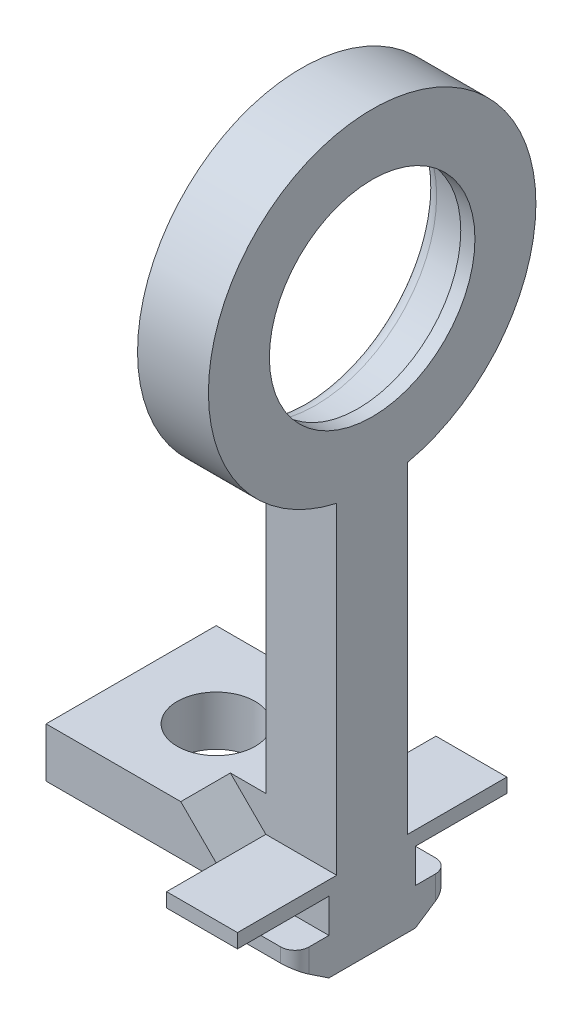
ISO-10303-21;
HEADER;
FILE_DESCRIPTION(('STEP AP214'),'2;1');
FILE_NAME('part.step','',(''),(''),'','','');
FILE_SCHEMA(('AUTOMOTIVE_DESIGN { 1 0 10303 214 1 1 1 1 }'));
ENDSEC;
DATA;
#1=APPLICATION_CONTEXT('core data for automotive mechanical design processes');
#2=APPLICATION_PROTOCOL_DEFINITION('international standard','automotive_design',2000,#1);
#3=PRODUCT_CONTEXT('',#1,'mechanical');
#4=PRODUCT('Part','Part','',(#3));
#5=PRODUCT_RELATED_PRODUCT_CATEGORY('part','',(#4));
#6=PRODUCT_DEFINITION_FORMATION('','',#4);
#7=PRODUCT_DEFINITION_CONTEXT('part definition',#1,'design');
#8=PRODUCT_DEFINITION('design','',#6,#7);
#9=PRODUCT_DEFINITION_SHAPE('','',#8);
#10=(LENGTH_UNIT() NAMED_UNIT(*) SI_UNIT(.MILLI.,.METRE.));
#11=(NAMED_UNIT(*) PLANE_ANGLE_UNIT() SI_UNIT($,.RADIAN.));
#12=(NAMED_UNIT(*) SI_UNIT($,.STERADIAN.) SOLID_ANGLE_UNIT());
#13=UNCERTAINTY_MEASURE_WITH_UNIT(LENGTH_MEASURE(1.E-05),#10,'distance_accuracy_value','');
#14=(GEOMETRIC_REPRESENTATION_CONTEXT(3) GLOBAL_UNCERTAINTY_ASSIGNED_CONTEXT((#13)) GLOBAL_UNIT_ASSIGNED_CONTEXT((#10,
#11,#12)) REPRESENTATION_CONTEXT('',''));
#15=CARTESIAN_POINT('',(0.,0.,0.));
#16=DIRECTION('',(0.,0.,1.));
#17=DIRECTION('',(1.,0.,0.));
#18=AXIS2_PLACEMENT_3D('',#15,#16,#17);
#19=CARTESIAN_POINT('',(-5.,0.,0.));
#20=DIRECTION('',(1.,0.,0.));
#21=DIRECTION('',(0.,0.,-1.));
#22=AXIS2_PLACEMENT_3D('',#19,#20,#21);
#23=CYLINDRICAL_SURFACE('',#22,8.55);
#24=CARTESIAN_POINT('',(-4.,0.,0.));
#25=DIRECTION('',(1.,0.,0.));
#26=DIRECTION('',(0.,0.,-1.));
#27=AXIS2_PLACEMENT_3D('',#24,#25,#26);
#28=CIRCLE('',#27,8.55);
#29=CARTESIAN_POINT('',(-4.,0.,-8.55));
#30=VERTEX_POINT('',#29);
#31=EDGE_CURVE('E45',#30,#30,#28,.F.);
#32=ORIENTED_EDGE('',*,*,#31,.T.);
#33=EDGE_LOOP('',(#32));
#34=FACE_BOUND('',#33,.T.);
#35=CARTESIAN_POINT('',(-1.,0.,0.));
#36=DIRECTION('',(1.,0.,0.));
#37=DIRECTION('',(0.,0.,-1.));
#38=AXIS2_PLACEMENT_3D('',#35,#36,#37);
#39=CIRCLE('',#38,8.55);
#40=CARTESIAN_POINT('',(-1.,0.,-8.55));
#41=VERTEX_POINT('',#40);
#42=EDGE_CURVE('E11',#41,#41,#39,.F.);
#43=ORIENTED_EDGE('',*,*,#42,.F.);
#44=EDGE_LOOP('',(#43));
#45=FACE_BOUND('',#44,.T.);
#46=ADVANCED_FACE('F37',(#34,#45),#23,.F.);
#47=CARTESIAN_POINT('',(-5.,0.,0.));
#48=DIRECTION('',(1.,0.,0.));
#49=DIRECTION('',(0.,0.,-1.));
#50=AXIS2_PLACEMENT_3D('',#47,#48,#49);
#51=PLANE('',#50);
#52=DIRECTION('',(0.,1.,0.));
#53=VECTOR('',#52,1.);
#54=CARTESIAN_POINT('',(-5.,-31.5,5.99999999999999));
#55=LINE('',#54,#53);
#56=CARTESIAN_POINT('',(-5.,-35.,5.99999999999999));
#57=VERTEX_POINT('',#56);
#58=CARTESIAN_POINT('',(-5.,-34.,5.99999999999999));
#59=VERTEX_POINT('',#58);
#60=EDGE_CURVE('E238',#57,#59,#55,.T.);
#61=ORIENTED_EDGE('',*,*,#60,.F.);
#62=DIRECTION('',(0.,0.,-1.));
#63=VECTOR('',#62,1.);
#64=CARTESIAN_POINT('',(-5.,-35.,3.05));
#65=LINE('',#64,#63);
#66=CARTESIAN_POINT('',(-5.,-35.,9.5));
#67=VERTEX_POINT('',#66);
#68=EDGE_CURVE('E261',#67,#57,#65,.T.);
#69=ORIENTED_EDGE('',*,*,#68,.F.);
#70=DIRECTION('',(0.,-1.,0.));
#71=VECTOR('',#70,1.);
#72=CARTESIAN_POINT('',(-5.,-35.,9.5));
#73=LINE('',#72,#71);
#74=CARTESIAN_POINT('',(-5.,-34.,9.50000000000001));
#75=VERTEX_POINT('',#74);
#76=EDGE_CURVE('E255',#75,#67,#73,.T.);
#77=ORIENTED_EDGE('',*,*,#76,.F.);
#78=DIRECTION('',(0.,0.,1.));
#79=VECTOR('',#78,1.);
#80=CARTESIAN_POINT('',(-5.,-34.,9.50000000000001));
#81=LINE('',#80,#79);
#82=EDGE_CURVE('E257',#59,#75,#81,.T.);
#83=ORIENTED_EDGE('',*,*,#82,.F.);
#84=EDGE_LOOP('',(#61,#69,#77,#83));
#85=FACE_BOUND('',#84,.T.);
#86=ADVANCED_FACE('F442',(#85),#51,.F.);
#87=DIRECTION('',(0.,0.,1.));
#88=VECTOR('',#87,1.);
#89=CARTESIAN_POINT('',(-5.,-35.,-6.00000000000001));
#90=LINE('',#89,#88);
#91=CARTESIAN_POINT('',(-5.,-35.,-3.05));
#92=VERTEX_POINT('',#91);
#93=CARTESIAN_POINT('',(-5.,-35.,3.05));
#94=VERTEX_POINT('',#93);
#95=EDGE_CURVE('E411',#92,#94,#90,.T.);
#96=ORIENTED_EDGE('',*,*,#95,.F.);
#97=DIRECTION('',(0.,1.,0.));
#98=VECTOR('',#97,1.);
#99=CARTESIAN_POINT('',(-5.,-35.,-3.05));
#100=LINE('',#99,#98);
#101=CARTESIAN_POINT('',(-5.,-37.4,-3.05));
#102=VERTEX_POINT('',#101);
#103=EDGE_CURVE('E288',#102,#92,#100,.T.);
#104=ORIENTED_EDGE('',*,*,#103,.F.);
#105=DIRECTION('',(0.,0.,1.));
#106=VECTOR('',#105,1.);
#107=CARTESIAN_POINT('',(-5.,-37.4,-3.05));
#108=LINE('',#107,#106);
#109=CARTESIAN_POINT('',(-5.,-37.4,-5.45));
#110=VERTEX_POINT('',#109);
#111=EDGE_CURVE('E285',#110,#102,#108,.T.);
#112=ORIENTED_EDGE('',*,*,#111,.F.);
#113=DIRECTION('',(0.,1.,0.));
#114=VECTOR('',#113,1.);
#115=CARTESIAN_POINT('',(-5.,-37.4,-5.45));
#116=LINE('',#115,#114);
#117=CARTESIAN_POINT('',(-5.,-38.4,-5.45));
#118=VERTEX_POINT('',#117);
#119=EDGE_CURVE('E282',#118,#110,#116,.T.);
#120=ORIENTED_EDGE('',*,*,#119,.F.);
#121=DIRECTION('',(0.,0.55470019622523,-0.832050294337843));
#122=VECTOR('',#121,1.);
#123=CARTESIAN_POINT('',(-5.,-38.4,-5.45));
#124=LINE('',#123,#122);
#125=CARTESIAN_POINT('',(-5.,-40.,-3.05));
#126=VERTEX_POINT('',#125);
#127=EDGE_CURVE('E279',#126,#118,#124,.T.);
#128=ORIENTED_EDGE('',*,*,#127,.F.);
#129=DIRECTION('',(0.,0.,-1.));
#130=VECTOR('',#129,1.);
#131=CARTESIAN_POINT('',(-5.,-40.,-3.05));
#132=LINE('',#131,#130);
#133=CARTESIAN_POINT('',(-5.,-40.,3.05));
#134=VERTEX_POINT('',#133);
#135=EDGE_CURVE('E276',#134,#126,#132,.T.);
#136=ORIENTED_EDGE('',*,*,#135,.F.);
#137=DIRECTION('',(0.,-0.554700196225229,-0.832050294337844));
#138=VECTOR('',#137,1.);
#139=CARTESIAN_POINT('',(-5.,-38.4,5.45));
#140=LINE('',#139,#138);
#141=CARTESIAN_POINT('',(-5.,-38.4,5.45));
#142=VERTEX_POINT('',#141);
#143=EDGE_CURVE('E273',#142,#134,#140,.T.);
#144=ORIENTED_EDGE('',*,*,#143,.F.);
#145=DIRECTION('',(0.,-1.,0.));
#146=VECTOR('',#145,1.);
#147=CARTESIAN_POINT('',(-5.,-37.4,5.45));
#148=LINE('',#147,#146);
#149=CARTESIAN_POINT('',(-5.,-37.4,5.45));
#150=VERTEX_POINT('',#149);
#151=EDGE_CURVE('E270',#150,#142,#148,.T.);
#152=ORIENTED_EDGE('',*,*,#151,.F.);
#153=DIRECTION('',(0.,0.,1.));
#154=VECTOR('',#153,1.);
#155=CARTESIAN_POINT('',(-5.,-37.4,3.05));
#156=LINE('',#155,#154);
#157=CARTESIAN_POINT('',(-5.,-37.4,3.05));
#158=VERTEX_POINT('',#157);
#159=EDGE_CURVE('E267',#158,#150,#156,.T.);
#160=ORIENTED_EDGE('',*,*,#159,.F.);
#161=DIRECTION('',(0.,-1.,0.));
#162=VECTOR('',#161,1.);
#163=CARTESIAN_POINT('',(-5.,-35.,3.05));
#164=LINE('',#163,#162);
#165=EDGE_CURVE('E264',#94,#158,#164,.T.);
#166=ORIENTED_EDGE('',*,*,#165,.F.);
#167=EDGE_LOOP('',(#96,#104,#112,#120,#128,#136,#144,#152,#160,#166));
#168=FACE_BOUND('',#167,.T.);
#169=ADVANCED_FACE('F477',(#168),#51,.F.);
#170=DIRECTION('',(0.,-1.,0.));
#171=VECTOR('',#170,1.);
#172=CARTESIAN_POINT('',(-5.,-31.5,-6.00000000000001));
#173=LINE('',#172,#171);
#174=CARTESIAN_POINT('',(-5.,-34.,-6.00000000000001));
#175=VERTEX_POINT('',#174);
#176=CARTESIAN_POINT('',(-5.,-35.,-6.00000000000001));
#177=VERTEX_POINT('',#176);
#178=EDGE_CURVE('E447',#175,#177,#173,.T.);
#179=ORIENTED_EDGE('',*,*,#178,.F.);
#180=CARTESIAN_POINT('',(-5.,-34.,-9.5));
#181=VERTEX_POINT('',#180);
#182=EDGE_CURVE('E252',#181,#175,#81,.T.);
#183=ORIENTED_EDGE('',*,*,#182,.F.);
#184=DIRECTION('',(0.,1.,0.));
#185=VECTOR('',#184,1.);
#186=CARTESIAN_POINT('',(-5.,-34.,-9.5));
#187=LINE('',#186,#185);
#188=CARTESIAN_POINT('',(-5.,-35.,-9.5));
#189=VERTEX_POINT('',#188);
#190=EDGE_CURVE('E293',#189,#181,#187,.T.);
#191=ORIENTED_EDGE('',*,*,#190,.F.);
#192=DIRECTION('',(0.,0.,-1.));
#193=VECTOR('',#192,1.);
#194=CARTESIAN_POINT('',(-5.,-35.,-3.05));
#195=LINE('',#194,#193);
#196=EDGE_CURVE('E291',#177,#189,#195,.T.);
#197=ORIENTED_EDGE('',*,*,#196,.F.);
#198=EDGE_LOOP('',(#179,#183,#191,#197));
#199=FACE_BOUND('',#198,.T.);
#200=ADVANCED_FACE('F440',(#199),#51,.F.);
#201=CARTESIAN_POINT('',(-5.,0.,0.));
#202=DIRECTION('',(1.,0.,0.));
#203=DIRECTION('',(0.,0.,-1.));
#204=AXIS2_PLACEMENT_3D('',#201,#202,#203);
#205=CIRCLE('',#204,9.55);
#206=CARTESIAN_POINT('',(-5.,0.,-9.55));
#207=VERTEX_POINT('',#206);
#208=EDGE_CURVE('E423',#207,#207,#205,.T.);
#209=ORIENTED_EDGE('',*,*,#208,.T.);
#210=EDGE_LOOP('',(#209));
#211=FACE_BOUND('',#210,.T.);
#212=DIRECTION('',(0.,0.,-1.));
#213=VECTOR('',#212,1.);
#214=CARTESIAN_POINT('',(-5.,-31.5,-6.00000000000001));
#215=LINE('',#214,#213);
#216=CARTESIAN_POINT('',(-5.,-31.5,2.5));
#217=VERTEX_POINT('',#216);
#218=CARTESIAN_POINT('',(-5.,-31.5,-2.5));
#219=VERTEX_POINT('',#218);
#220=EDGE_CURVE('E408',#217,#219,#215,.T.);
#221=ORIENTED_EDGE('',*,*,#220,.F.);
#222=DIRECTION('',(0.,-1.,0.));
#223=VECTOR('',#222,1.);
#224=CARTESIAN_POINT('',(-5.,-35.,2.5));
#225=LINE('',#224,#223);
#226=CARTESIAN_POINT('',(-5.,-11.2761917330276,2.5));
#227=VERTEX_POINT('',#226);
#228=EDGE_CURVE('E368',#227,#217,#225,.T.);
#229=ORIENTED_EDGE('',*,*,#228,.F.);
#230=CARTESIAN_POINT('',(-5.,0.,0.));
#231=DIRECTION('',(1.,0.,0.));
#232=DIRECTION('',(0.,0.,-1.));
#233=AXIS2_PLACEMENT_3D('',#230,#231,#232);
#234=CIRCLE('',#233,11.55);
#235=CARTESIAN_POINT('',(-5.,-11.2761917330276,-2.5));
#236=VERTEX_POINT('',#235);
#237=EDGE_CURVE('E382',#236,#227,#234,.T.);
#238=ORIENTED_EDGE('',*,*,#237,.F.);
#239=DIRECTION('',(0.,1.,0.));
#240=VECTOR('',#239,1.);
#241=CARTESIAN_POINT('',(-5.,-35.,-2.5));
#242=LINE('',#241,#240);
#243=EDGE_CURVE('E366',#219,#236,#242,.T.);
#244=ORIENTED_EDGE('',*,*,#243,.F.);
#245=EDGE_LOOP('',(#221,#229,#238,#244));
#246=FACE_BOUND('',#245,.T.);
#247=ADVANCED_FACE('F436',(#211,#246),#51,.F.);
#248=CARTESIAN_POINT('',(-5.,0.,0.));
#249=DIRECTION('',(1.,0.,0.));
#250=DIRECTION('',(0.,0.,-1.));
#251=AXIS2_PLACEMENT_3D('',#248,#249,#250);
#252=CYLINDRICAL_SURFACE('',#251,11.55);
#253=DIRECTION('',(1.,0.,0.));
#254=VECTOR('',#253,1.);
#255=CARTESIAN_POINT('',(-5.,-11.2761917330276,2.5));
#256=LINE('',#255,#254);
#257=CARTESIAN_POINT('',(0.,-11.2761917330276,2.5));
#258=VERTEX_POINT('',#257);
#259=EDGE_CURVE('E376',#227,#258,#256,.T.);
#260=ORIENTED_EDGE('',*,*,#259,.T.);
#261=CARTESIAN_POINT('',(0.,0.,0.));
#262=DIRECTION('',(1.,0.,0.));
#263=DIRECTION('',(0.,0.,-1.));
#264=AXIS2_PLACEMENT_3D('',#261,#262,#263);
#265=CIRCLE('',#264,11.55);
#266=CARTESIAN_POINT('',(0.,-11.2761917330276,-2.5));
#267=VERTEX_POINT('',#266);
#268=EDGE_CURVE('E379',#267,#258,#265,.T.);
#269=ORIENTED_EDGE('',*,*,#268,.F.);
#270=DIRECTION('',(1.,0.,0.));
#271=VECTOR('',#270,1.);
#272=CARTESIAN_POINT('',(-5.,-11.2761917330276,-2.5));
#273=LINE('',#272,#271);
#274=EDGE_CURVE('E372',#236,#267,#273,.T.);
#275=ORIENTED_EDGE('',*,*,#274,.F.);
#276=ORIENTED_EDGE('',*,*,#237,.T.);
#277=EDGE_LOOP('',(#260,#269,#275,#276));
#278=FACE_BOUND('',#277,.T.);
#279=ADVANCED_FACE('F439',(#278),#252,.T.);
#280=CARTESIAN_POINT('',(0.,0.,0.));
#281=DIRECTION('',(1.,0.,0.));
#282=DIRECTION('',(0.,0.,-1.));
#283=AXIS2_PLACEMENT_3D('',#280,#281,#282);
#284=PLANE('',#283);
#285=DIRECTION('',(0.,0.,1.));
#286=VECTOR('',#285,1.);
#287=CARTESIAN_POINT('',(0.,-37.4,3.05));
#288=LINE('',#287,#286);
#289=CARTESIAN_POINT('',(0.,-37.4,3.05));
#290=VERTEX_POINT('',#289);
#291=CARTESIAN_POINT('',(0.,-37.4,4.45));
#292=VERTEX_POINT('',#291);
#293=EDGE_CURVE('E307',#290,#292,#288,.T.);
#294=ORIENTED_EDGE('',*,*,#293,.T.);
#295=DIRECTION('',(0.,-1.,0.));
#296=VECTOR('',#295,1.);
#297=CARTESIAN_POINT('',(0.,0.,4.45000000000013));
#298=LINE('',#297,#296);
#299=CARTESIAN_POINT('',(0.,-39.0666666666667,4.44999999999999));
#300=VERTEX_POINT('',#299);
#301=EDGE_CURVE('E393',#292,#300,#298,.T.);
#302=ORIENTED_EDGE('',*,*,#301,.T.);
#303=DIRECTION('',(0.,-0.554700196225229,-0.832050294337844));
#304=VECTOR('',#303,1.);
#305=CARTESIAN_POINT('',(0.,-38.4,5.45));
#306=LINE('',#305,#304);
#307=CARTESIAN_POINT('',(0.,-40.,3.05));
#308=VERTEX_POINT('',#307);
#309=EDGE_CURVE('E310',#300,#308,#306,.T.);
#310=ORIENTED_EDGE('',*,*,#309,.T.);
#311=DIRECTION('',(0.,0.,-1.));
#312=VECTOR('',#311,1.);
#313=CARTESIAN_POINT('',(0.,-40.,-3.05));
#314=LINE('',#313,#312);
#315=CARTESIAN_POINT('',(0.,-40.,-3.05));
#316=VERTEX_POINT('',#315);
#317=EDGE_CURVE('E312',#308,#316,#314,.T.);
#318=ORIENTED_EDGE('',*,*,#317,.T.);
#319=DIRECTION('',(0.,0.55470019622523,-0.832050294337843));
#320=VECTOR('',#319,1.);
#321=CARTESIAN_POINT('',(0.,-38.4,-5.45));
#322=LINE('',#321,#320);
#323=CARTESIAN_POINT('',(0.,-39.0666666666667,-4.45));
#324=VERTEX_POINT('',#323);
#325=EDGE_CURVE('E315',#316,#324,#322,.T.);
#326=ORIENTED_EDGE('',*,*,#325,.T.);
#327=DIRECTION('',(0.,1.,0.));
#328=VECTOR('',#327,1.);
#329=CARTESIAN_POINT('',(0.,0.,-4.45000000000003));
#330=LINE('',#329,#328);
#331=CARTESIAN_POINT('',(0.,-37.4,-4.45));
#332=VERTEX_POINT('',#331);
#333=EDGE_CURVE('E390',#324,#332,#330,.T.);
#334=ORIENTED_EDGE('',*,*,#333,.T.);
#335=DIRECTION('',(0.,0.,1.));
#336=VECTOR('',#335,1.);
#337=CARTESIAN_POINT('',(0.,-37.4,-3.05));
#338=LINE('',#337,#336);
#339=CARTESIAN_POINT('',(0.,-37.4,-3.05));
#340=VERTEX_POINT('',#339);
#341=EDGE_CURVE('E318',#332,#340,#338,.T.);
#342=ORIENTED_EDGE('',*,*,#341,.T.);
#343=DIRECTION('',(0.,1.,0.));
#344=VECTOR('',#343,1.);
#345=CARTESIAN_POINT('',(0.,-35.,-3.05));
#346=LINE('',#345,#344);
#347=CARTESIAN_POINT('',(0.,-35.,-3.05));
#348=VERTEX_POINT('',#347);
#349=EDGE_CURVE('E320',#340,#348,#346,.T.);
#350=ORIENTED_EDGE('',*,*,#349,.T.);
#351=DIRECTION('',(0.,0.,-1.));
#352=VECTOR('',#351,1.);
#353=CARTESIAN_POINT('',(0.,-35.,-3.05));
#354=LINE('',#353,#352);
#355=CARTESIAN_POINT('',(0.,-35.,-9.5));
#356=VERTEX_POINT('',#355);
#357=EDGE_CURVE('E323',#348,#356,#354,.T.);
#358=ORIENTED_EDGE('',*,*,#357,.T.);
#359=DIRECTION('',(0.,1.,0.));
#360=VECTOR('',#359,1.);
#361=CARTESIAN_POINT('',(0.,-34.,-9.5));
#362=LINE('',#361,#360);
#363=CARTESIAN_POINT('',(0.,-34.,-9.5));
#364=VERTEX_POINT('',#363);
#365=EDGE_CURVE('E326',#356,#364,#362,.T.);
#366=ORIENTED_EDGE('',*,*,#365,.T.);
#367=DIRECTION('',(0.,0.,1.));
#368=VECTOR('',#367,1.);
#369=CARTESIAN_POINT('',(0.,-34.,9.50000000000001));
#370=LINE('',#369,#368);
#371=CARTESIAN_POINT('',(0.,-34.,-2.5));
#372=VERTEX_POINT('',#371);
#373=EDGE_CURVE('E246',#364,#372,#370,.T.);
#374=ORIENTED_EDGE('',*,*,#373,.T.);
#375=DIRECTION('',(0.,1.,0.));
#376=VECTOR('',#375,1.);
#377=CARTESIAN_POINT('',(0.,-35.,-2.5));
#378=LINE('',#377,#376);
#379=EDGE_CURVE('E365',#372,#267,#378,.T.);
#380=ORIENTED_EDGE('',*,*,#379,.T.);
#381=ORIENTED_EDGE('',*,*,#268,.T.);
#382=DIRECTION('',(0.,-1.,0.));
#383=VECTOR('',#382,1.);
#384=CARTESIAN_POINT('',(0.,-35.,2.5));
#385=LINE('',#384,#383);
#386=CARTESIAN_POINT('',(0.,-34.,2.5));
#387=VERTEX_POINT('',#386);
#388=EDGE_CURVE('E369',#258,#387,#385,.T.);
#389=ORIENTED_EDGE('',*,*,#388,.T.);
#390=CARTESIAN_POINT('',(0.,-34.,9.50000000000001));
#391=VERTEX_POINT('',#390);
#392=EDGE_CURVE('E244',#387,#391,#370,.T.);
#393=ORIENTED_EDGE('',*,*,#392,.T.);
#394=DIRECTION('',(0.,-1.,0.));
#395=VECTOR('',#394,1.);
#396=CARTESIAN_POINT('',(0.,-35.,9.5));
#397=LINE('',#396,#395);
#398=CARTESIAN_POINT('',(0.,-35.,9.5));
#399=VERTEX_POINT('',#398);
#400=EDGE_CURVE('E298',#391,#399,#397,.T.);
#401=ORIENTED_EDGE('',*,*,#400,.T.);
#402=DIRECTION('',(0.,0.,-1.));
#403=VECTOR('',#402,1.);
#404=CARTESIAN_POINT('',(0.,-35.,3.05));
#405=LINE('',#404,#403);
#406=CARTESIAN_POINT('',(0.,-35.,3.05));
#407=VERTEX_POINT('',#406);
#408=EDGE_CURVE('E301',#399,#407,#405,.T.);
#409=ORIENTED_EDGE('',*,*,#408,.T.);
#410=DIRECTION('',(0.,-1.,0.));
#411=VECTOR('',#410,1.);
#412=CARTESIAN_POINT('',(0.,-35.,3.05));
#413=LINE('',#412,#411);
#414=EDGE_CURVE('E304',#407,#290,#413,.T.);
#415=ORIENTED_EDGE('',*,*,#414,.T.);
#416=EDGE_LOOP('',(#294,#302,#310,#318,#326,#334,#342,#350,#358,#366,#374,#380,#381,#389,#393,
#401,#409,#415));
#417=FACE_BOUND('',#416,.T.);
#418=CARTESIAN_POINT('',(0.,0.,0.));
#419=DIRECTION('',(1.,0.,0.));
#420=DIRECTION('',(0.,0.,-1.));
#421=AXIS2_PLACEMENT_3D('',#418,#419,#420);
#422=CIRCLE('',#421,7.25);
#423=CARTESIAN_POINT('',(0.,0.,-7.25));
#424=VERTEX_POINT('',#423);
#425=EDGE_CURVE('E646',#424,#424,#422,.T.);
#426=ORIENTED_EDGE('',*,*,#425,.F.);
#427=EDGE_LOOP('',(#426));
#428=FACE_BOUND('',#427,.T.);
#429=ADVANCED_FACE('F456',(#417,#428),#284,.T.);
#430=CARTESIAN_POINT('',(-5.,-35.,-2.5));
#431=DIRECTION('',(0.,0.,-1.));
#432=DIRECTION('',(0.,1.,0.));
#433=AXIS2_PLACEMENT_3D('',#430,#431,#432);
#434=PLANE('',#433);
#435=DIRECTION('',(1.,0.,0.));
#436=VECTOR('',#435,1.);
#437=CARTESIAN_POINT('',(-5.,-34.,-2.5));
#438=LINE('',#437,#436);
#439=CARTESIAN_POINT('',(-5.,-34.,-2.5));
#440=VERTEX_POINT('',#439);
#441=EDGE_CURVE('E331',#440,#372,#438,.T.);
#442=ORIENTED_EDGE('',*,*,#441,.F.);
#443=DIRECTION('',(0.707106781186546,-0.707106781186549,0.));
#444=VECTOR('',#443,1.);
#445=CARTESIAN_POINT('',(-7.50000000000001,-31.5,-2.5));
#446=LINE('',#445,#444);
#447=CARTESIAN_POINT('',(-7.50000000000001,-31.5,-2.5));
#448=VERTEX_POINT('',#447);
#449=EDGE_CURVE('E421',#440,#448,#446,.F.);
#450=ORIENTED_EDGE('',*,*,#449,.T.);
#451=DIRECTION('',(-1.,0.,0.));
#452=VECTOR('',#451,1.);
#453=CARTESIAN_POINT('',(-5.,-31.5,-2.5));
#454=LINE('',#453,#452);
#455=EDGE_CURVE('E52',#219,#448,#454,.T.);
#456=ORIENTED_EDGE('',*,*,#455,.F.);
#457=ORIENTED_EDGE('',*,*,#243,.T.);
#458=ORIENTED_EDGE('',*,*,#274,.T.);
#459=ORIENTED_EDGE('',*,*,#379,.F.);
#460=EDGE_LOOP('',(#442,#450,#456,#457,#458,#459));
#461=FACE_BOUND('',#460,.T.);
#462=ADVANCED_FACE('F461',(#461),#434,.T.);
#463=CARTESIAN_POINT('',(-5.,-35.,2.5));
#464=DIRECTION('',(0.,0.,1.));
#465=DIRECTION('',(0.,-1.,0.));
#466=AXIS2_PLACEMENT_3D('',#463,#464,#465);
#467=PLANE('',#466);
#468=DIRECTION('',(-1.,0.,0.));
#469=VECTOR('',#468,1.);
#470=CARTESIAN_POINT('',(-5.,-34.,2.5));
#471=LINE('',#470,#469);
#472=CARTESIAN_POINT('',(-5.,-34.,2.5));
#473=VERTEX_POINT('',#472);
#474=EDGE_CURVE('E385',#387,#473,#471,.T.);
#475=ORIENTED_EDGE('',*,*,#474,.F.);
#476=ORIENTED_EDGE('',*,*,#388,.F.);
#477=ORIENTED_EDGE('',*,*,#259,.F.);
#478=ORIENTED_EDGE('',*,*,#228,.T.);
#479=DIRECTION('',(1.,0.,0.));
#480=VECTOR('',#479,1.);
#481=CARTESIAN_POINT('',(-5.,-31.5,2.5));
#482=LINE('',#481,#480);
#483=CARTESIAN_POINT('',(-7.50000000000001,-31.5,2.5));
#484=VERTEX_POINT('',#483);
#485=EDGE_CURVE('E413',#484,#217,#482,.T.);
#486=ORIENTED_EDGE('',*,*,#485,.F.);
#487=DIRECTION('',(-0.707106781186546,0.707106781186549,0.));
#488=VECTOR('',#487,1.);
#489=CARTESIAN_POINT('',(-7.50000000000001,-31.5,2.5));
#490=LINE('',#489,#488);
#491=EDGE_CURVE('E60',#484,#473,#490,.F.);
#492=ORIENTED_EDGE('',*,*,#491,.T.);
#493=EDGE_LOOP('',(#475,#476,#477,#478,#486,#492));
#494=FACE_BOUND('',#493,.T.);
#495=ADVANCED_FACE('F451',(#494),#467,.T.);
#496=CARTESIAN_POINT('',(-5.,-34.,9.50000000000001));
#497=DIRECTION('',(0.,1.,0.));
#498=DIRECTION('',(0.,0.,1.));
#499=AXIS2_PLACEMENT_3D('',#496,#497,#498);
#500=PLANE('',#499);
#501=ORIENTED_EDGE('',*,*,#182,.T.);
#502=EDGE_CURVE('E256',#175,#440,#81,.T.);
#503=ORIENTED_EDGE('',*,*,#502,.T.);
#504=ORIENTED_EDGE('',*,*,#441,.T.);
#505=ORIENTED_EDGE('',*,*,#373,.F.);
#506=DIRECTION('',(1.,0.,0.));
#507=VECTOR('',#506,1.);
#508=CARTESIAN_POINT('',(-5.,-34.,-9.5));
#509=LINE('',#508,#507);
#510=EDGE_CURVE('E329',#181,#364,#509,.T.);
#511=ORIENTED_EDGE('',*,*,#510,.F.);
#512=EDGE_LOOP('',(#501,#503,#504,#505,#511));
#513=FACE_BOUND('',#512,.T.);
#514=ADVANCED_FACE('F469',(#513),#500,.T.);
#515=ORIENTED_EDGE('',*,*,#392,.F.);
#516=ORIENTED_EDGE('',*,*,#474,.T.);
#517=EDGE_CURVE('E258',#473,#59,#81,.T.);
#518=ORIENTED_EDGE('',*,*,#517,.T.);
#519=ORIENTED_EDGE('',*,*,#82,.T.);
#520=DIRECTION('',(1.,0.,0.));
#521=VECTOR('',#520,1.);
#522=CARTESIAN_POINT('',(-5.,-34.,9.50000000000001));
#523=LINE('',#522,#521);
#524=EDGE_CURVE('E295',#75,#391,#523,.T.);
#525=ORIENTED_EDGE('',*,*,#524,.T.);
#526=EDGE_LOOP('',(#515,#516,#518,#519,#525));
#527=FACE_BOUND('',#526,.T.);
#528=ADVANCED_FACE('F529',(#527),#500,.T.);
#529=CARTESIAN_POINT('',(-5.,-34.,-9.5));
#530=DIRECTION('',(0.,0.,-1.));
#531=DIRECTION('',(-1.,0.,0.));
#532=AXIS2_PLACEMENT_3D('',#529,#530,#531);
#533=PLANE('',#532);
#534=ORIENTED_EDGE('',*,*,#365,.F.);
#535=DIRECTION('',(1.,0.,0.));
#536=VECTOR('',#535,1.);
#537=CARTESIAN_POINT('',(-5.,-35.,-9.5));
#538=LINE('',#537,#536);
#539=EDGE_CURVE('E332',#189,#356,#538,.T.);
#540=ORIENTED_EDGE('',*,*,#539,.F.);
#541=ORIENTED_EDGE('',*,*,#190,.T.);
#542=ORIENTED_EDGE('',*,*,#510,.T.);
#543=EDGE_LOOP('',(#534,#540,#541,#542));
#544=FACE_BOUND('',#543,.T.);
#545=ADVANCED_FACE('F594',(#544),#533,.T.);
#546=CARTESIAN_POINT('',(-5.,-35.,-3.05));
#547=DIRECTION('',(0.,-1.,0.));
#548=DIRECTION('',(0.,0.,-1.));
#549=AXIS2_PLACEMENT_3D('',#546,#547,#548);
#550=PLANE('',#549);
#551=CARTESIAN_POINT('',(-11.,-35.,0.));
#552=DIRECTION('',(0.,-1.,0.));
#553=DIRECTION('',(0.,0.,-1.));
#554=AXIS2_PLACEMENT_3D('',#551,#552,#553);
#555=CIRCLE('',#554,2.75);
#556=CARTESIAN_POINT('',(-11.,-35.,-2.75000000000001));
#557=VERTEX_POINT('',#556);
#558=EDGE_CURVE('E645',#557,#557,#555,.F.);
#559=ORIENTED_EDGE('',*,*,#558,.T.);
#560=EDGE_LOOP('',(#559));
#561=FACE_BOUND('',#560,.T.);
#562=ORIENTED_EDGE('',*,*,#357,.F.);
#563=DIRECTION('',(1.,0.,0.));
#564=VECTOR('',#563,1.);
#565=CARTESIAN_POINT('',(-5.,-35.,-3.05));
#566=LINE('',#565,#564);
#567=EDGE_CURVE('E334',#92,#348,#566,.T.);
#568=ORIENTED_EDGE('',*,*,#567,.F.);
#569=ORIENTED_EDGE('',*,*,#95,.T.);
#570=DIRECTION('',(1.,0.,0.));
#571=VECTOR('',#570,1.);
#572=CARTESIAN_POINT('',(-5.,-35.,3.05));
#573=LINE('',#572,#571);
#574=EDGE_CURVE('E358',#94,#407,#573,.T.);
#575=ORIENTED_EDGE('',*,*,#574,.T.);
#576=ORIENTED_EDGE('',*,*,#408,.F.);
#577=DIRECTION('',(1.,0.,0.));
#578=VECTOR('',#577,1.);
#579=CARTESIAN_POINT('',(-5.,-35.,9.5));
#580=LINE('',#579,#578);
#581=EDGE_CURVE('E360',#67,#399,#580,.T.);
#582=ORIENTED_EDGE('',*,*,#581,.F.);
#583=ORIENTED_EDGE('',*,*,#68,.T.);
#584=DIRECTION('',(1.,0.,0.));
#585=VECTOR('',#584,1.);
#586=CARTESIAN_POINT('',(-17.,-35.,5.99999999999999));
#587=LINE('',#586,#585);
#588=CARTESIAN_POINT('',(-17.,-35.,5.99999999999999));
#589=VERTEX_POINT('',#588);
#590=EDGE_CURVE('E513',#589,#57,#587,.T.);
#591=ORIENTED_EDGE('',*,*,#590,.F.);
#592=DIRECTION('',(0.,0.,1.));
#593=VECTOR('',#592,1.);
#594=CARTESIAN_POINT('',(-17.,-35.,-6.00000000000001));
#595=LINE('',#594,#593);
#596=CARTESIAN_POINT('',(-17.,-35.,-6.00000000000001));
#597=VERTEX_POINT('',#596);
#598=EDGE_CURVE('E234',#597,#589,#595,.T.);
#599=ORIENTED_EDGE('',*,*,#598,.F.);
#600=DIRECTION('',(1.,0.,0.));
#601=VECTOR('',#600,1.);
#602=CARTESIAN_POINT('',(-17.,-35.,-6.00000000000001));
#603=LINE('',#602,#601);
#604=EDGE_CURVE('E248',#597,#177,#603,.T.);
#605=ORIENTED_EDGE('',*,*,#604,.T.);
#606=ORIENTED_EDGE('',*,*,#196,.T.);
#607=ORIENTED_EDGE('',*,*,#539,.T.);
#608=EDGE_LOOP('',(#562,#568,#569,#575,#576,#582,#583,#591,#599,#605,#606,#607));
#609=FACE_BOUND('',#608,.T.);
#610=ADVANCED_FACE('F523',(#561,#609),#550,.T.);
#611=CARTESIAN_POINT('',(-5.,-35.,-3.05));
#612=DIRECTION('',(0.,0.,-1.));
#613=DIRECTION('',(0.,1.,0.));
#614=AXIS2_PLACEMENT_3D('',#611,#612,#613);
#615=PLANE('',#614);
#616=ORIENTED_EDGE('',*,*,#349,.F.);
#617=DIRECTION('',(1.,0.,0.));
#618=VECTOR('',#617,1.);
#619=CARTESIAN_POINT('',(-5.,-37.4,-3.05));
#620=LINE('',#619,#618);
#621=EDGE_CURVE('E336',#102,#340,#620,.T.);
#622=ORIENTED_EDGE('',*,*,#621,.F.);
#623=ORIENTED_EDGE('',*,*,#103,.T.);
#624=ORIENTED_EDGE('',*,*,#567,.T.);
#625=EDGE_LOOP('',(#616,#622,#623,#624));
#626=FACE_BOUND('',#625,.T.);
#627=ADVANCED_FACE('F610',(#626),#615,.T.);
#628=CARTESIAN_POINT('',(-5.,-37.4,-3.05));
#629=DIRECTION('',(0.,1.,0.));
#630=DIRECTION('',(0.,0.,1.));
#631=AXIS2_PLACEMENT_3D('',#628,#629,#630);
#632=PLANE('',#631);
#633=ORIENTED_EDGE('',*,*,#341,.F.);
#634=CARTESIAN_POINT('',(-1.,-37.4,-4.45));
#635=DIRECTION('',(0.,1.,0.));
#636=DIRECTION('',(0.,0.,1.));
#637=AXIS2_PLACEMENT_3D('',#634,#635,#636);
#638=CIRCLE('',#637,1.);
#639=CARTESIAN_POINT('',(-1.,-37.4,-5.45));
#640=VERTEX_POINT('',#639);
#641=EDGE_CURVE('E402',#332,#640,#638,.T.);
#642=ORIENTED_EDGE('',*,*,#641,.T.);
#643=DIRECTION('',(1.,0.,0.));
#644=VECTOR('',#643,1.);
#645=CARTESIAN_POINT('',(-5.,-37.4,-5.45));
#646=LINE('',#645,#644);
#647=EDGE_CURVE('E339',#110,#640,#646,.T.);
#648=ORIENTED_EDGE('',*,*,#647,.F.);
#649=ORIENTED_EDGE('',*,*,#111,.T.);
#650=ORIENTED_EDGE('',*,*,#621,.T.);
#651=EDGE_LOOP('',(#633,#642,#648,#649,#650));
#652=FACE_BOUND('',#651,.T.);
#653=ADVANCED_FACE('F566',(#652),#632,.T.);
#654=CARTESIAN_POINT('',(-5.,-37.4,-5.45));
#655=DIRECTION('',(0.,0.,-1.));
#656=DIRECTION('',(0.,1.,0.));
#657=AXIS2_PLACEMENT_3D('',#654,#655,#656);
#658=PLANE('',#657);
#659=ORIENTED_EDGE('',*,*,#647,.T.);
#660=DIRECTION('',(0.,1.,0.));
#661=VECTOR('',#660,1.);
#662=CARTESIAN_POINT('',(-1.,-37.4,-5.45));
#663=LINE('',#662,#661);
#664=CARTESIAN_POINT('',(-1.,-38.4,-5.45));
#665=VERTEX_POINT('',#664);
#666=EDGE_CURVE('E404',#640,#665,#663,.F.);
#667=ORIENTED_EDGE('',*,*,#666,.T.);
#668=DIRECTION('',(1.,0.,0.));
#669=VECTOR('',#668,1.);
#670=CARTESIAN_POINT('',(-5.,-38.4,-5.45));
#671=LINE('',#670,#669);
#672=EDGE_CURVE('E342',#118,#665,#671,.T.);
#673=ORIENTED_EDGE('',*,*,#672,.F.);
#674=ORIENTED_EDGE('',*,*,#119,.T.);
#675=EDGE_LOOP('',(#659,#667,#673,#674));
#676=FACE_BOUND('',#675,.T.);
#677=ADVANCED_FACE('F569',(#676),#658,.T.);
#678=CARTESIAN_POINT('',(-5.,-38.4,-5.45));
#679=DIRECTION('',(0.,-0.832050294337843,-0.55470019622523));
#680=DIRECTION('',(0.,0.55470019622523,-0.832050294337843));
#681=AXIS2_PLACEMENT_3D('',#678,#679,#680);
#682=PLANE('',#681);
#683=ORIENTED_EDGE('',*,*,#672,.T.);
#684=CARTESIAN_POINT('',(-1.,-39.0666666666667,-4.45));
#685=DIRECTION('',(0.,-0.832050294337843,-0.55470019622523));
#686=DIRECTION('',(0.,0.55470019622523,-0.832050294337843));
#687=AXIS2_PLACEMENT_3D('',#684,#685,#686);
#688=ELLIPSE('',#687,1.20185042515466,1.);
#689=EDGE_CURVE('E406',#665,#324,#688,.T.);
#690=ORIENTED_EDGE('',*,*,#689,.T.);
#691=ORIENTED_EDGE('',*,*,#325,.F.);
#692=DIRECTION('',(1.,0.,0.));
#693=VECTOR('',#692,1.);
#694=CARTESIAN_POINT('',(-5.,-40.,-3.05));
#695=LINE('',#694,#693);
#696=EDGE_CURVE('E345',#126,#316,#695,.T.);
#697=ORIENTED_EDGE('',*,*,#696,.F.);
#698=ORIENTED_EDGE('',*,*,#127,.T.);
#699=EDGE_LOOP('',(#683,#690,#691,#697,#698));
#700=FACE_BOUND('',#699,.T.);
#701=ADVANCED_FACE('F572',(#700),#682,.T.);
#702=CARTESIAN_POINT('',(-5.,-40.,-3.05));
#703=DIRECTION('',(0.,-1.,0.));
#704=DIRECTION('',(0.,0.,-1.));
#705=AXIS2_PLACEMENT_3D('',#702,#703,#704);
#706=PLANE('',#705);
#707=ORIENTED_EDGE('',*,*,#317,.F.);
#708=DIRECTION('',(1.,0.,0.));
#709=VECTOR('',#708,1.);
#710=CARTESIAN_POINT('',(-5.,-40.,3.05));
#711=LINE('',#710,#709);
#712=EDGE_CURVE('E347',#134,#308,#711,.T.);
#713=ORIENTED_EDGE('',*,*,#712,.F.);
#714=ORIENTED_EDGE('',*,*,#135,.T.);
#715=ORIENTED_EDGE('',*,*,#696,.T.);
#716=EDGE_LOOP('',(#707,#713,#714,#715));
#717=FACE_BOUND('',#716,.T.);
#718=ADVANCED_FACE('F558',(#717),#706,.T.);
#719=CARTESIAN_POINT('',(-5.,-38.4,5.45));
#720=DIRECTION('',(0.,-0.832050294337844,0.554700196225229));
#721=DIRECTION('',(0.,-0.554700196225229,-0.832050294337844));
#722=AXIS2_PLACEMENT_3D('',#719,#720,#721);
#723=PLANE('',#722);
#724=ORIENTED_EDGE('',*,*,#309,.F.);
#725=CARTESIAN_POINT('',(-1.,-39.0666666666667,4.44999999999999));
#726=DIRECTION('',(0.,-0.832050294337844,0.554700196225229));
#727=DIRECTION('',(0.,-0.554700196225229,-0.832050294337844));
#728=AXIS2_PLACEMENT_3D('',#725,#726,#727);
#729=ELLIPSE('',#728,1.20185042515467,1.);
#730=CARTESIAN_POINT('',(-1.,-38.4,5.45));
#731=VERTEX_POINT('',#730);
#732=EDGE_CURVE('E396',#300,#731,#729,.T.);
#733=ORIENTED_EDGE('',*,*,#732,.T.);
#734=DIRECTION('',(1.,0.,0.));
#735=VECTOR('',#734,1.);
#736=CARTESIAN_POINT('',(-5.,-38.4,5.45));
#737=LINE('',#736,#735);
#738=EDGE_CURVE('E350',#142,#731,#737,.T.);
#739=ORIENTED_EDGE('',*,*,#738,.F.);
#740=ORIENTED_EDGE('',*,*,#143,.T.);
#741=ORIENTED_EDGE('',*,*,#712,.T.);
#742=EDGE_LOOP('',(#724,#733,#739,#740,#741));
#743=FACE_BOUND('',#742,.T.);
#744=ADVANCED_FACE('F548',(#743),#723,.T.);
#745=CARTESIAN_POINT('',(-5.,-37.4,5.45));
#746=DIRECTION('',(0.,0.,1.));
#747=DIRECTION('',(0.,-1.,0.));
#748=AXIS2_PLACEMENT_3D('',#745,#746,#747);
#749=PLANE('',#748);
#750=ORIENTED_EDGE('',*,*,#738,.T.);
#751=DIRECTION('',(0.,-1.,0.));
#752=VECTOR('',#751,1.);
#753=CARTESIAN_POINT('',(-1.,-37.4,5.45));
#754=LINE('',#753,#752);
#755=CARTESIAN_POINT('',(-1.,-37.4,5.45));
#756=VERTEX_POINT('',#755);
#757=EDGE_CURVE('E398',#731,#756,#754,.F.);
#758=ORIENTED_EDGE('',*,*,#757,.T.);
#759=DIRECTION('',(1.,0.,0.));
#760=VECTOR('',#759,1.);
#761=CARTESIAN_POINT('',(-5.,-37.4,5.45));
#762=LINE('',#761,#760);
#763=EDGE_CURVE('E353',#150,#756,#762,.T.);
#764=ORIENTED_EDGE('',*,*,#763,.F.);
#765=ORIENTED_EDGE('',*,*,#151,.T.);
#766=EDGE_LOOP('',(#750,#758,#764,#765));
#767=FACE_BOUND('',#766,.T.);
#768=ADVANCED_FACE('F551',(#767),#749,.T.);
#769=CARTESIAN_POINT('',(-5.,-37.4,3.05));
#770=DIRECTION('',(0.,1.,0.));
#771=DIRECTION('',(0.,0.,1.));
#772=AXIS2_PLACEMENT_3D('',#769,#770,#771);
#773=PLANE('',#772);
#774=ORIENTED_EDGE('',*,*,#763,.T.);
#775=CARTESIAN_POINT('',(-1.,-37.4,4.45));
#776=DIRECTION('',(0.,1.,0.));
#777=DIRECTION('',(0.,0.,1.));
#778=AXIS2_PLACEMENT_3D('',#775,#776,#777);
#779=CIRCLE('',#778,1.);
#780=EDGE_CURVE('E400',#756,#292,#779,.T.);
#781=ORIENTED_EDGE('',*,*,#780,.T.);
#782=ORIENTED_EDGE('',*,*,#293,.F.);
#783=DIRECTION('',(1.,0.,0.));
#784=VECTOR('',#783,1.);
#785=CARTESIAN_POINT('',(-5.,-37.4,3.05));
#786=LINE('',#785,#784);
#787=EDGE_CURVE('E356',#158,#290,#786,.T.);
#788=ORIENTED_EDGE('',*,*,#787,.F.);
#789=ORIENTED_EDGE('',*,*,#159,.T.);
#790=EDGE_LOOP('',(#774,#781,#782,#788,#789));
#791=FACE_BOUND('',#790,.T.);
#792=ADVANCED_FACE('F542',(#791),#773,.T.);
#793=CARTESIAN_POINT('',(-5.,-35.,3.05));
#794=DIRECTION('',(0.,0.,1.));
#795=DIRECTION('',(0.,-1.,0.));
#796=AXIS2_PLACEMENT_3D('',#793,#794,#795);
#797=PLANE('',#796);
#798=ORIENTED_EDGE('',*,*,#414,.F.);
#799=ORIENTED_EDGE('',*,*,#574,.F.);
#800=ORIENTED_EDGE('',*,*,#165,.T.);
#801=ORIENTED_EDGE('',*,*,#787,.T.);
#802=EDGE_LOOP('',(#798,#799,#800,#801));
#803=FACE_BOUND('',#802,.T.);
#804=ADVANCED_FACE('F538',(#803),#797,.T.);
#805=CARTESIAN_POINT('',(-5.,-35.,9.5));
#806=DIRECTION('',(0.,0.,1.));
#807=DIRECTION('',(0.,-1.,0.));
#808=AXIS2_PLACEMENT_3D('',#805,#806,#807);
#809=PLANE('',#808);
#810=ORIENTED_EDGE('',*,*,#400,.F.);
#811=ORIENTED_EDGE('',*,*,#524,.F.);
#812=ORIENTED_EDGE('',*,*,#76,.T.);
#813=ORIENTED_EDGE('',*,*,#581,.T.);
#814=EDGE_LOOP('',(#810,#811,#812,#813));
#815=FACE_BOUND('',#814,.T.);
#816=ADVANCED_FACE('F486',(#815),#809,.T.);
#817=CARTESIAN_POINT('',(-1.,0.,4.45000000000013));
#818=DIRECTION('',(0.,-1.,0.));
#819=DIRECTION('',(0.,0.,-1.));
#820=AXIS2_PLACEMENT_3D('',#817,#818,#819);
#821=CYLINDRICAL_SURFACE('',#820,1.);
#822=ORIENTED_EDGE('',*,*,#780,.F.);
#823=ORIENTED_EDGE('',*,*,#757,.F.);
#824=ORIENTED_EDGE('',*,*,#732,.F.);
#825=ORIENTED_EDGE('',*,*,#301,.F.);
#826=EDGE_LOOP('',(#822,#823,#824,#825));
#827=FACE_BOUND('',#826,.T.);
#828=ADVANCED_FACE('F482',(#827),#821,.T.);
#829=CARTESIAN_POINT('',(-1.,0.,-4.45000000000003));
#830=DIRECTION('',(0.,1.,0.));
#831=DIRECTION('',(0.,0.,1.));
#832=AXIS2_PLACEMENT_3D('',#829,#830,#831);
#833=CYLINDRICAL_SURFACE('',#832,1.);
#834=ORIENTED_EDGE('',*,*,#689,.F.);
#835=ORIENTED_EDGE('',*,*,#666,.F.);
#836=ORIENTED_EDGE('',*,*,#641,.F.);
#837=ORIENTED_EDGE('',*,*,#333,.F.);
#838=EDGE_LOOP('',(#834,#835,#836,#837));
#839=FACE_BOUND('',#838,.T.);
#840=ADVANCED_FACE('F485',(#839),#833,.T.);
#841=CARTESIAN_POINT('',(-17.,-31.5,5.99999999999999));
#842=DIRECTION('',(0.,0.,-1.));
#843=DIRECTION('',(0.,1.,0.));
#844=AXIS2_PLACEMENT_3D('',#841,#842,#843);
#845=PLANE('',#844);
#846=ORIENTED_EDGE('',*,*,#60,.T.);
#847=DIRECTION('',(0.707106781186546,-0.707106781186549,0.));
#848=VECTOR('',#847,1.);
#849=CARTESIAN_POINT('',(-7.50000000000001,-31.5,5.99999999999999));
#850=LINE('',#849,#848);
#851=CARTESIAN_POINT('',(-7.50000000000001,-31.5,5.99999999999999));
#852=VERTEX_POINT('',#851);
#853=EDGE_CURVE('E243',#59,#852,#850,.F.);
#854=ORIENTED_EDGE('',*,*,#853,.T.);
#855=DIRECTION('',(1.,0.,0.));
#856=VECTOR('',#855,1.);
#857=CARTESIAN_POINT('',(-17.,-31.5,5.99999999999999));
#858=LINE('',#857,#856);
#859=CARTESIAN_POINT('',(-17.,-31.5,5.99999999999999));
#860=VERTEX_POINT('',#859);
#861=EDGE_CURVE('E222',#860,#852,#858,.T.);
#862=ORIENTED_EDGE('',*,*,#861,.F.);
#863=DIRECTION('',(0.,1.,0.));
#864=VECTOR('',#863,1.);
#865=CARTESIAN_POINT('',(-17.,-31.5,5.99999999999999));
#866=LINE('',#865,#864);
#867=EDGE_CURVE('E229',#589,#860,#866,.T.);
#868=ORIENTED_EDGE('',*,*,#867,.F.);
#869=ORIENTED_EDGE('',*,*,#590,.T.);
#870=EDGE_LOOP('',(#846,#854,#862,#868,#869));
#871=FACE_BOUND('',#870,.T.);
#872=ADVANCED_FACE('F241',(#871),#845,.F.);
#873=CARTESIAN_POINT('',(-17.,-31.5,-6.00000000000001));
#874=DIRECTION('',(0.,-1.,0.));
#875=DIRECTION('',(0.,0.,-1.));
#876=AXIS2_PLACEMENT_3D('',#873,#874,#875);
#877=PLANE('',#876);
#878=CARTESIAN_POINT('',(-11.,-31.5,0.));
#879=DIRECTION('',(0.,1.,0.));
#880=DIRECTION('',(0.,0.,1.));
#881=AXIS2_PLACEMENT_3D('',#878,#879,#880);
#882=CIRCLE('',#881,2.75);
#883=CARTESIAN_POINT('',(-11.,-31.5,2.74999999999999));
#884=VERTEX_POINT('',#883);
#885=EDGE_CURVE('E516',#884,#884,#882,.T.);
#886=ORIENTED_EDGE('',*,*,#885,.F.);
#887=EDGE_LOOP('',(#886));
#888=FACE_BOUND('',#887,.T.);
#889=ORIENTED_EDGE('',*,*,#861,.T.);
#890=DIRECTION('',(0.,0.,-1.));
#891=VECTOR('',#890,1.);
#892=CARTESIAN_POINT('',(-7.50000000000001,-31.5,-6.00000000000001));
#893=LINE('',#892,#891);
#894=EDGE_CURVE('E415',#852,#484,#893,.T.);
#895=ORIENTED_EDGE('',*,*,#894,.T.);
#896=ORIENTED_EDGE('',*,*,#485,.T.);
#897=ORIENTED_EDGE('',*,*,#220,.T.);
#898=ORIENTED_EDGE('',*,*,#455,.T.);
#899=DIRECTION('',(0.,0.,-1.));
#900=VECTOR('',#899,1.);
#901=CARTESIAN_POINT('',(-7.50000000000001,-31.5,-6.00000000000001));
#902=LINE('',#901,#900);
#903=CARTESIAN_POINT('',(-7.50000000000001,-31.5,-6.00000000000001));
#904=VERTEX_POINT('',#903);
#905=EDGE_CURVE('E410',#448,#904,#902,.T.);
#906=ORIENTED_EDGE('',*,*,#905,.T.);
#907=DIRECTION('',(1.,0.,0.));
#908=VECTOR('',#907,1.);
#909=CARTESIAN_POINT('',(-17.,-31.5,-6.00000000000001));
#910=LINE('',#909,#908);
#911=CARTESIAN_POINT('',(-17.,-31.5,-6.00000000000001));
#912=VERTEX_POINT('',#911);
#913=EDGE_CURVE('E225',#912,#904,#910,.T.);
#914=ORIENTED_EDGE('',*,*,#913,.F.);
#915=DIRECTION('',(0.,0.,-1.));
#916=VECTOR('',#915,1.);
#917=CARTESIAN_POINT('',(-17.,-31.5,-6.00000000000001));
#918=LINE('',#917,#916);
#919=EDGE_CURVE('E217',#860,#912,#918,.T.);
#920=ORIENTED_EDGE('',*,*,#919,.F.);
#921=EDGE_LOOP('',(#889,#895,#896,#897,#898,#906,#914,#920));
#922=FACE_BOUND('',#921,.T.);
#923=ADVANCED_FACE('F219',(#888,#922),#877,.F.);
#924=CARTESIAN_POINT('',(-17.,-31.5,-6.00000000000001));
#925=DIRECTION('',(0.,0.,1.));
#926=DIRECTION('',(0.,-1.,0.));
#927=AXIS2_PLACEMENT_3D('',#924,#925,#926);
#928=PLANE('',#927);
#929=ORIENTED_EDGE('',*,*,#913,.T.);
#930=DIRECTION('',(-0.707106781186546,0.707106781186549,0.));
#931=VECTOR('',#930,1.);
#932=CARTESIAN_POINT('',(-7.50000000000001,-31.5,-6.00000000000001));
#933=LINE('',#932,#931);
#934=EDGE_CURVE('E418',#904,#175,#933,.F.);
#935=ORIENTED_EDGE('',*,*,#934,.T.);
#936=ORIENTED_EDGE('',*,*,#178,.T.);
#937=ORIENTED_EDGE('',*,*,#604,.F.);
#938=DIRECTION('',(0.,-1.,0.));
#939=VECTOR('',#938,1.);
#940=CARTESIAN_POINT('',(-17.,-31.5,-6.00000000000001));
#941=LINE('',#940,#939);
#942=EDGE_CURVE('E228',#912,#597,#941,.T.);
#943=ORIENTED_EDGE('',*,*,#942,.F.);
#944=EDGE_LOOP('',(#929,#935,#936,#937,#943));
#945=FACE_BOUND('',#944,.T.);
#946=ADVANCED_FACE('F507',(#945),#928,.F.);
#947=CARTESIAN_POINT('',(-17.,0.,0.));
#948=DIRECTION('',(-1.,0.,0.));
#949=DIRECTION('',(0.,0.,1.));
#950=AXIS2_PLACEMENT_3D('',#947,#948,#949);
#951=PLANE('',#950);
#952=ORIENTED_EDGE('',*,*,#867,.T.);
#953=ORIENTED_EDGE('',*,*,#919,.T.);
#954=ORIENTED_EDGE('',*,*,#942,.T.);
#955=ORIENTED_EDGE('',*,*,#598,.T.);
#956=EDGE_LOOP('',(#952,#953,#954,#955));
#957=FACE_BOUND('',#956,.T.);
#958=ADVANCED_FACE('F232',(#957),#951,.T.);
#959=CARTESIAN_POINT('',(-11.,-40.001,0.));
#960=DIRECTION('',(0.,1.,0.));
#961=DIRECTION('',(0.,0.,1.));
#962=AXIS2_PLACEMENT_3D('',#959,#960,#961);
#963=CYLINDRICAL_SURFACE('',#962,2.75);
#964=ORIENTED_EDGE('',*,*,#558,.F.);
#965=EDGE_LOOP('',(#964));
#966=FACE_BOUND('',#965,.T.);
#967=ORIENTED_EDGE('',*,*,#885,.T.);
#968=EDGE_LOOP('',(#967));
#969=FACE_BOUND('',#968,.T.);
#970=ADVANCED_FACE('F497',(#966,#969),#963,.F.);
#971=CARTESIAN_POINT('',(-7.50000000000001,-31.5,-6.00000000000001));
#972=DIRECTION('',(-0.707106781186549,-0.707106781186546,0.));
#973=DIRECTION('',(0.,0.,-1.));
#974=AXIS2_PLACEMENT_3D('',#971,#972,#973);
#975=PLANE('',#974);
#976=ORIENTED_EDGE('',*,*,#853,.F.);
#977=ORIENTED_EDGE('',*,*,#517,.F.);
#978=ORIENTED_EDGE('',*,*,#491,.F.);
#979=ORIENTED_EDGE('',*,*,#894,.F.);
#980=EDGE_LOOP('',(#976,#977,#978,#979));
#981=FACE_BOUND('',#980,.T.);
#982=ADVANCED_FACE('F492',(#981),#975,.F.);
#983=CARTESIAN_POINT('',(-7.50000000000001,-31.5,-6.00000000000001));
#984=DIRECTION('',(-0.707106781186549,-0.707106781186546,0.));
#985=DIRECTION('',(0.,0.,-1.));
#986=AXIS2_PLACEMENT_3D('',#983,#984,#985);
#987=PLANE('',#986);
#988=ORIENTED_EDGE('',*,*,#449,.F.);
#989=ORIENTED_EDGE('',*,*,#502,.F.);
#990=ORIENTED_EDGE('',*,*,#934,.F.);
#991=ORIENTED_EDGE('',*,*,#905,.F.);
#992=EDGE_LOOP('',(#988,#989,#990,#991));
#993=FACE_BOUND('',#992,.T.);
#994=ADVANCED_FACE('F433',(#993),#987,.F.);
#995=CARTESIAN_POINT('',(-4.,0.,0.));
#996=DIRECTION('',(1.,0.,0.));
#997=DIRECTION('',(0.,0.,-1.));
#998=AXIS2_PLACEMENT_3D('',#995,#996,#997);
#999=TOROIDAL_SURFACE('',#998,9.55,1.);
#1000=ORIENTED_EDGE('',*,*,#31,.F.);
#1001=EDGE_LOOP('',(#1000));
#1002=FACE_BOUND('',#1001,.T.);
#1003=ORIENTED_EDGE('',*,*,#208,.F.);
#1004=EDGE_LOOP('',(#1003));
#1005=FACE_BOUND('',#1004,.T.);
#1006=ADVANCED_FACE('F39',(#1002,#1005),#999,.T.);
#1007=CARTESIAN_POINT('',(-1.,0.,0.));
#1008=DIRECTION('',(1.,0.,0.));
#1009=DIRECTION('',(0.,0.,-1.));
#1010=AXIS2_PLACEMENT_3D('',#1007,#1008,#1009);
#1011=CYLINDRICAL_SURFACE('',#1010,7.25);
#1012=CARTESIAN_POINT('',(-1.,0.,0.));
#1013=DIRECTION('',(1.,0.,0.));
#1014=DIRECTION('',(0.,0.,-1.));
#1015=AXIS2_PLACEMENT_3D('',#1012,#1013,#1014);
#1016=CIRCLE('',#1015,7.25);
#1017=CARTESIAN_POINT('',(-1.,0.,-7.25));
#1018=VERTEX_POINT('',#1017);
#1019=EDGE_CURVE('E643',#1018,#1018,#1016,.T.);
#1020=ORIENTED_EDGE('',*,*,#1019,.F.);
#1021=EDGE_LOOP('',(#1020));
#1022=FACE_BOUND('',#1021,.T.);
#1023=ORIENTED_EDGE('',*,*,#425,.T.);
#1024=EDGE_LOOP('',(#1023));
#1025=FACE_BOUND('',#1024,.T.);
#1026=ADVANCED_FACE('F432',(#1022,#1025),#1011,.F.);
#1027=CARTESIAN_POINT('',(-1.,0.,0.));
#1028=DIRECTION('',(1.,0.,0.));
#1029=DIRECTION('',(0.,0.,-1.));
#1030=AXIS2_PLACEMENT_3D('',#1027,#1028,#1029);
#1031=PLANE('',#1030);
#1032=ORIENTED_EDGE('',*,*,#1019,.T.);
#1033=EDGE_LOOP('',(#1032));
#1034=FACE_BOUND('',#1033,.T.);
#1035=ORIENTED_EDGE('',*,*,#42,.T.);
#1036=EDGE_LOOP('',(#1035));
#1037=FACE_BOUND('',#1036,.T.);
#1038=ADVANCED_FACE('F634',(#1034,#1037),#1031,.F.);
#1039=CLOSED_SHELL('',(#46,#86,#169,#200,#247,#279,#429,#462,#495,#514,#528,#545,#610,#627,#653,
#677,#701,#718,#744,#768,#792,#804,#816,#828,#840,#872,#923,#946,#958,#970,#982,#994,#1006,
#1026,#1038));
#1040=MANIFOLD_SOLID_BREP('B2',#1039);
#1041=ADVANCED_BREP_SHAPE_REPRESENTATION('',(#18,#1040),#14);
#1042=SHAPE_DEFINITION_REPRESENTATION(#9,#1041);
ENDSEC;
END-ISO-10303-21;
